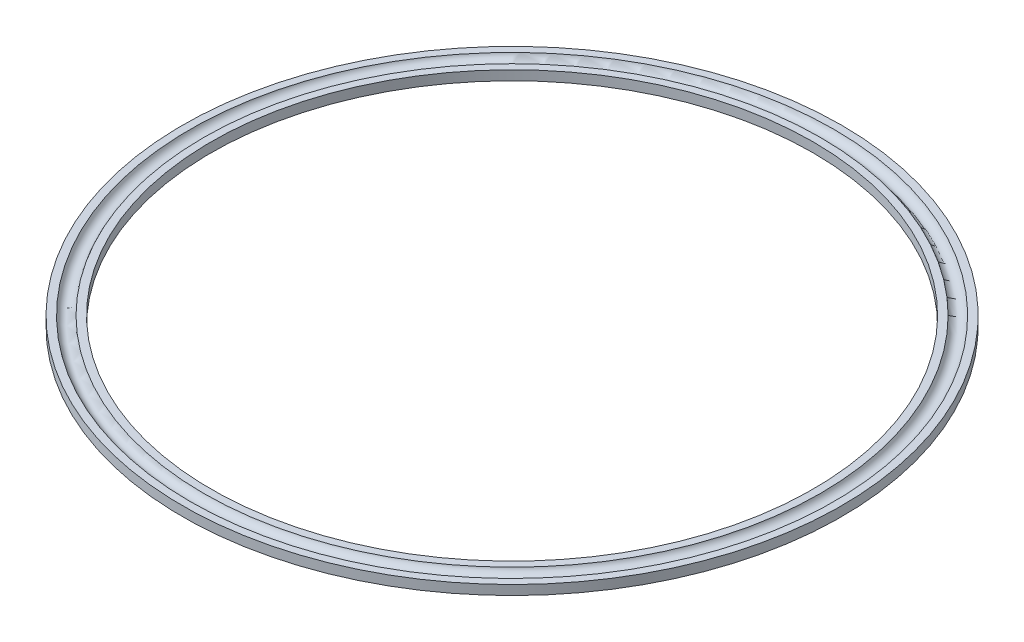
ISO-10303-21;
HEADER;
FILE_DESCRIPTION(('STEP AP214'),'2;1');
FILE_NAME('part.step','',(''),(''),'','','');
FILE_SCHEMA(('AUTOMOTIVE_DESIGN { 1 0 10303 214 1 1 1 1 }'));
ENDSEC;
DATA;
#1=APPLICATION_CONTEXT('core data for automotive mechanical design processes');
#2=APPLICATION_PROTOCOL_DEFINITION('international standard','automotive_design',2000,#1);
#3=PRODUCT_CONTEXT('',#1,'mechanical');
#4=PRODUCT('Part','Part','',(#3));
#5=PRODUCT_RELATED_PRODUCT_CATEGORY('part','',(#4));
#6=PRODUCT_DEFINITION_FORMATION('','',#4);
#7=PRODUCT_DEFINITION_CONTEXT('part definition',#1,'design');
#8=PRODUCT_DEFINITION('design','',#6,#7);
#9=PRODUCT_DEFINITION_SHAPE('','',#8);
#10=(LENGTH_UNIT() NAMED_UNIT(*) SI_UNIT(.MILLI.,.METRE.));
#11=(NAMED_UNIT(*) PLANE_ANGLE_UNIT() SI_UNIT($,.RADIAN.));
#12=(NAMED_UNIT(*) SI_UNIT($,.STERADIAN.) SOLID_ANGLE_UNIT());
#13=UNCERTAINTY_MEASURE_WITH_UNIT(LENGTH_MEASURE(1.E-05),#10,'distance_accuracy_value','');
#14=(GEOMETRIC_REPRESENTATION_CONTEXT(3) GLOBAL_UNCERTAINTY_ASSIGNED_CONTEXT((#13)) GLOBAL_UNIT_ASSIGNED_CONTEXT((#10,
#11,#12)) REPRESENTATION_CONTEXT('',''));
#15=CARTESIAN_POINT('',(0.,0.,0.));
#16=DIRECTION('',(0.,0.,1.));
#17=DIRECTION('',(1.,0.,0.));
#18=AXIS2_PLACEMENT_3D('',#15,#16,#17);
#19=CARTESIAN_POINT('',(0.,0.,0.));
#20=DIRECTION('',(0.,-1.,0.));
#21=DIRECTION('',(0.,0.,-1.));
#22=AXIS2_PLACEMENT_3D('',#19,#20,#21);
#23=CYLINDRICAL_SURFACE('',#22,100.0125);
#24=CARTESIAN_POINT('',(0.,3.17499999999998,0.));
#25=DIRECTION('',(0.,-1.,0.));
#26=DIRECTION('',(0.,0.,-1.));
#27=AXIS2_PLACEMENT_3D('',#24,#25,#26);
#28=CIRCLE('',#27,100.0125);
#29=CARTESIAN_POINT('',(0.,3.17499999999998,-100.0125));
#30=VERTEX_POINT('',#29);
#31=EDGE_CURVE('E10',#30,#30,#28,.T.);
#32=ORIENTED_EDGE('',*,*,#31,.F.);
#33=EDGE_LOOP('',(#32));
#34=FACE_BOUND('',#33,.T.);
#35=CARTESIAN_POINT('',(0.,0.,0.));
#36=DIRECTION('',(0.,-1.,0.));
#37=DIRECTION('',(0.,0.,-1.));
#38=AXIS2_PLACEMENT_3D('',#35,#36,#37);
#39=CIRCLE('',#38,100.0125);
#40=CARTESIAN_POINT('',(0.,0.,-100.0125));
#41=VERTEX_POINT('',#40);
#42=EDGE_CURVE('E60',#41,#41,#39,.T.);
#43=ORIENTED_EDGE('',*,*,#42,.T.);
#44=EDGE_LOOP('',(#43));
#45=FACE_BOUND('',#44,.T.);
#46=ADVANCED_FACE('F38',(#34,#45),#23,.F.);
#47=CARTESIAN_POINT('',(-100.0125,3.17499999999998,0.));
#48=DIRECTION('',(0.,-1.,0.));
#49=DIRECTION('',(0.,0.,-1.));
#50=AXIS2_PLACEMENT_3D('',#47,#48,#49);
#51=PLANE('',#50);
#52=CARTESIAN_POINT('',(0.,3.17499999999998,0.));
#53=DIRECTION('',(0.,-1.,0.));
#54=DIRECTION('',(0.,0.,-1.));
#55=AXIS2_PLACEMENT_3D('',#52,#53,#54);
#56=CIRCLE('',#55,102.4799778732);
#57=CARTESIAN_POINT('',(0.,3.17499999999998,-102.4799778732));
#58=VERTEX_POINT('',#57);
#59=EDGE_CURVE('E44',#58,#58,#56,.T.);
#60=ORIENTED_EDGE('',*,*,#59,.F.);
#61=EDGE_LOOP('',(#60));
#62=FACE_BOUND('',#61,.T.);
#63=ORIENTED_EDGE('',*,*,#31,.T.);
#64=EDGE_LOOP('',(#63));
#65=FACE_BOUND('',#64,.T.);
#66=ADVANCED_FACE('F85',(#62,#65),#51,.F.);
#67=CARTESIAN_POINT('',(0.,3.81,0.));
#68=DIRECTION('',(0.,-1.,0.));
#69=DIRECTION('',(0.,0.,-1.));
#70=AXIS2_PLACEMENT_3D('',#67,#68,#69);
#71=TOROIDAL_SURFACE('',#70,104.775,2.38124999999999);
#72=CARTESIAN_POINT('',(0.,3.17499999999999,0.));
#73=DIRECTION('',(0.,-1.,0.));
#74=DIRECTION('',(0.,0.,-1.));
#75=AXIS2_PLACEMENT_3D('',#72,#73,#74);
#76=CIRCLE('',#75,107.0700221268);
#77=CARTESIAN_POINT('',(0.,3.17499999999999,-107.0700221268));
#78=VERTEX_POINT('',#77);
#79=EDGE_CURVE('E48',#78,#78,#76,.T.);
#80=ORIENTED_EDGE('',*,*,#79,.F.);
#81=EDGE_LOOP('',(#80));
#82=FACE_BOUND('',#81,.T.);
#83=ORIENTED_EDGE('',*,*,#59,.T.);
#84=EDGE_LOOP('',(#83));
#85=FACE_BOUND('',#84,.T.);
#86=ADVANCED_FACE('F80',(#82,#85),#71,.F.);
#87=CARTESIAN_POINT('',(-109.5375,3.17499999999999,0.));
#88=DIRECTION('',(0.,-1.,0.));
#89=DIRECTION('',(0.,0.,-1.));
#90=AXIS2_PLACEMENT_3D('',#87,#88,#89);
#91=PLANE('',#90);
#92=CARTESIAN_POINT('',(0.,3.17499999999998,0.));
#93=DIRECTION('',(0.,-1.,0.));
#94=DIRECTION('',(0.,0.,-1.));
#95=AXIS2_PLACEMENT_3D('',#92,#93,#94);
#96=CIRCLE('',#95,109.5375);
#97=CARTESIAN_POINT('',(0.,3.17499999999998,-109.5375));
#98=VERTEX_POINT('',#97);
#99=EDGE_CURVE('E52',#98,#98,#96,.T.);
#100=ORIENTED_EDGE('',*,*,#99,.F.);
#101=EDGE_LOOP('',(#100));
#102=FACE_BOUND('',#101,.T.);
#103=ORIENTED_EDGE('',*,*,#79,.T.);
#104=EDGE_LOOP('',(#103));
#105=FACE_BOUND('',#104,.T.);
#106=ADVANCED_FACE('F74',(#102,#105),#91,.F.);
#107=CARTESIAN_POINT('',(0.,0.,0.));
#108=DIRECTION('',(0.,-1.,0.));
#109=DIRECTION('',(0.,0.,-1.));
#110=AXIS2_PLACEMENT_3D('',#107,#108,#109);
#111=CYLINDRICAL_SURFACE('',#110,109.5375);
#112=CARTESIAN_POINT('',(0.,0.,0.));
#113=DIRECTION('',(0.,-1.,0.));
#114=DIRECTION('',(0.,0.,-1.));
#115=AXIS2_PLACEMENT_3D('',#112,#113,#114);
#116=CIRCLE('',#115,109.5375);
#117=CARTESIAN_POINT('',(0.,0.,-109.5375));
#118=VERTEX_POINT('',#117);
#119=EDGE_CURVE('E57',#118,#118,#116,.T.);
#120=ORIENTED_EDGE('',*,*,#119,.F.);
#121=EDGE_LOOP('',(#120));
#122=FACE_BOUND('',#121,.T.);
#123=ORIENTED_EDGE('',*,*,#99,.T.);
#124=EDGE_LOOP('',(#123));
#125=FACE_BOUND('',#124,.T.);
#126=ADVANCED_FACE('F68',(#122,#125),#111,.T.);
#127=CARTESIAN_POINT('',(-100.0125,0.,0.));
#128=DIRECTION('',(0.,1.,0.));
#129=DIRECTION('',(0.,0.,1.));
#130=AXIS2_PLACEMENT_3D('',#127,#128,#129);
#131=PLANE('',#130);
#132=ORIENTED_EDGE('',*,*,#42,.F.);
#133=EDGE_LOOP('',(#132));
#134=FACE_BOUND('',#133,.T.);
#135=ORIENTED_EDGE('',*,*,#119,.T.);
#136=EDGE_LOOP('',(#135));
#137=FACE_BOUND('',#136,.T.);
#138=ADVANCED_FACE('F65',(#134,#137),#131,.F.);
#139=CLOSED_SHELL('',(#46,#66,#86,#106,#126,#138));
#140=MANIFOLD_SOLID_BREP('B2',#139);
#141=ADVANCED_BREP_SHAPE_REPRESENTATION('',(#18,#140),#14);
#142=SHAPE_DEFINITION_REPRESENTATION(#9,#141);
ENDSEC;
END-ISO-10303-21;
